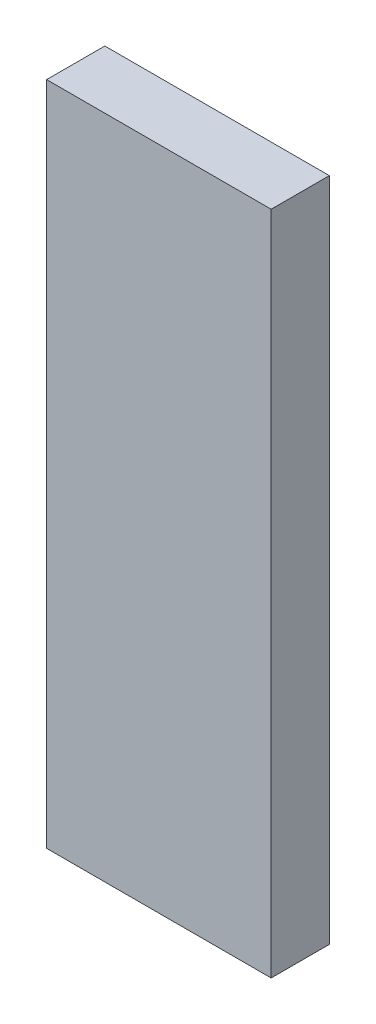
ISO-10303-21;
HEADER;
FILE_DESCRIPTION(('STEP AP214'),'2;1');
FILE_NAME('part.step','',(''),(''),'','','');
FILE_SCHEMA(('AUTOMOTIVE_DESIGN { 1 0 10303 214 1 1 1 1 }'));
ENDSEC;
DATA;
#1=APPLICATION_CONTEXT('core data for automotive mechanical design processes');
#2=APPLICATION_PROTOCOL_DEFINITION('international standard','automotive_design',2000,#1);
#3=PRODUCT_CONTEXT('',#1,'mechanical');
#4=PRODUCT('Part','Part','',(#3));
#5=PRODUCT_RELATED_PRODUCT_CATEGORY('part','',(#4));
#6=PRODUCT_DEFINITION_FORMATION('','',#4);
#7=PRODUCT_DEFINITION_CONTEXT('part definition',#1,'design');
#8=PRODUCT_DEFINITION('design','',#6,#7);
#9=PRODUCT_DEFINITION_SHAPE('','',#8);
#10=(LENGTH_UNIT() NAMED_UNIT(*) SI_UNIT(.MILLI.,.METRE.));
#11=(NAMED_UNIT(*) PLANE_ANGLE_UNIT() SI_UNIT($,.RADIAN.));
#12=(NAMED_UNIT(*) SI_UNIT($,.STERADIAN.) SOLID_ANGLE_UNIT());
#13=UNCERTAINTY_MEASURE_WITH_UNIT(LENGTH_MEASURE(1.E-05),#10,'distance_accuracy_value','');
#14=(GEOMETRIC_REPRESENTATION_CONTEXT(3) GLOBAL_UNCERTAINTY_ASSIGNED_CONTEXT((#13)) GLOBAL_UNIT_ASSIGNED_CONTEXT((#10,
#11,#12)) REPRESENTATION_CONTEXT('',''));
#15=CARTESIAN_POINT('',(0.,0.,0.));
#16=DIRECTION('',(0.,0.,1.));
#17=DIRECTION('',(1.,0.,0.));
#18=AXIS2_PLACEMENT_3D('',#15,#16,#17);
#19=CARTESIAN_POINT('',(-24.5,145.3,-6.35));
#20=DIRECTION('',(1.,0.,0.));
#21=DIRECTION('',(0.,0.,-1.));
#22=AXIS2_PLACEMENT_3D('',#19,#20,#21);
#23=PLANE('',#22);
#24=DIRECTION('',(0.,0.,1.));
#25=VECTOR('',#24,1.);
#26=CARTESIAN_POINT('',(-24.5,0.,-6.35));
#27=LINE('',#26,#25);
#28=CARTESIAN_POINT('',(-24.5,0.,-6.35));
#29=VERTEX_POINT('',#28);
#30=CARTESIAN_POINT('',(-24.5,0.,6.35));
#31=VERTEX_POINT('',#30);
#32=EDGE_CURVE('E97',#29,#31,#27,.T.);
#33=ORIENTED_EDGE('',*,*,#32,.T.);
#34=DIRECTION('',(0.,-1.,0.));
#35=VECTOR('',#34,1.);
#36=CARTESIAN_POINT('',(-24.5,145.3,6.35));
#37=LINE('',#36,#35);
#38=CARTESIAN_POINT('',(-24.5,145.3,6.35));
#39=VERTEX_POINT('',#38);
#40=EDGE_CURVE('E11',#39,#31,#37,.T.);
#41=ORIENTED_EDGE('',*,*,#40,.F.);
#42=DIRECTION('',(0.,0.,1.));
#43=VECTOR('',#42,1.);
#44=CARTESIAN_POINT('',(-24.5,145.3,-6.35));
#45=LINE('',#44,#43);
#46=CARTESIAN_POINT('',(-24.5,145.3,-6.35));
#47=VERTEX_POINT('',#46);
#48=EDGE_CURVE('E85',#47,#39,#45,.T.);
#49=ORIENTED_EDGE('',*,*,#48,.F.);
#50=DIRECTION('',(0.,-1.,0.));
#51=VECTOR('',#50,1.);
#52=CARTESIAN_POINT('',(-24.5,145.3,-6.35));
#53=LINE('',#52,#51);
#54=EDGE_CURVE('E93',#47,#29,#53,.T.);
#55=ORIENTED_EDGE('',*,*,#54,.T.);
#56=EDGE_LOOP('',(#33,#41,#49,#55));
#57=FACE_BOUND('',#56,.T.);
#58=ADVANCED_FACE('F34',(#57),#23,.F.);
#59=CARTESIAN_POINT('',(24.5,145.3,6.35));
#60=DIRECTION('',(0.,0.,-1.));
#61=DIRECTION('',(-1.,0.,0.));
#62=AXIS2_PLACEMENT_3D('',#59,#60,#61);
#63=PLANE('',#62);
#64=DIRECTION('',(1.,0.,0.));
#65=VECTOR('',#64,1.);
#66=CARTESIAN_POINT('',(24.5,0.,6.35));
#67=LINE('',#66,#65);
#68=CARTESIAN_POINT('',(24.5,0.,6.35));
#69=VERTEX_POINT('',#68);
#70=EDGE_CURVE('E89',#31,#69,#67,.T.);
#71=ORIENTED_EDGE('',*,*,#70,.T.);
#72=DIRECTION('',(0.,-1.,0.));
#73=VECTOR('',#72,1.);
#74=CARTESIAN_POINT('',(24.5,145.3,6.35));
#75=LINE('',#74,#73);
#76=CARTESIAN_POINT('',(24.5,145.3,6.35));
#77=VERTEX_POINT('',#76);
#78=EDGE_CURVE('E42',#77,#69,#75,.T.);
#79=ORIENTED_EDGE('',*,*,#78,.F.);
#80=DIRECTION('',(1.,0.,0.));
#81=VECTOR('',#80,1.);
#82=CARTESIAN_POINT('',(24.5,145.3,6.35));
#83=LINE('',#82,#81);
#84=EDGE_CURVE('E80',#39,#77,#83,.T.);
#85=ORIENTED_EDGE('',*,*,#84,.F.);
#86=ORIENTED_EDGE('',*,*,#40,.T.);
#87=EDGE_LOOP('',(#71,#79,#85,#86));
#88=FACE_BOUND('',#87,.T.);
#89=ADVANCED_FACE('F88',(#88),#63,.F.);
#90=CARTESIAN_POINT('',(24.5,145.3,-6.35));
#91=DIRECTION('',(-1.,0.,0.));
#92=DIRECTION('',(0.,0.,1.));
#93=AXIS2_PLACEMENT_3D('',#90,#91,#92);
#94=PLANE('',#93);
#95=DIRECTION('',(0.,0.,-1.));
#96=VECTOR('',#95,1.);
#97=CARTESIAN_POINT('',(24.5,0.,-6.35));
#98=LINE('',#97,#96);
#99=CARTESIAN_POINT('',(24.5,0.,-6.35));
#100=VERTEX_POINT('',#99);
#101=EDGE_CURVE('E67',#69,#100,#98,.T.);
#102=ORIENTED_EDGE('',*,*,#101,.T.);
#103=DIRECTION('',(0.,-1.,0.));
#104=VECTOR('',#103,1.);
#105=CARTESIAN_POINT('',(24.5,145.3,-6.35));
#106=LINE('',#105,#104);
#107=CARTESIAN_POINT('',(24.5,145.3,-6.35));
#108=VERTEX_POINT('',#107);
#109=EDGE_CURVE('E90',#108,#100,#106,.T.);
#110=ORIENTED_EDGE('',*,*,#109,.F.);
#111=DIRECTION('',(0.,0.,-1.));
#112=VECTOR('',#111,1.);
#113=CARTESIAN_POINT('',(24.5,145.3,-6.35));
#114=LINE('',#113,#112);
#115=EDGE_CURVE('E83',#77,#108,#114,.T.);
#116=ORIENTED_EDGE('',*,*,#115,.F.);
#117=ORIENTED_EDGE('',*,*,#78,.T.);
#118=EDGE_LOOP('',(#102,#110,#116,#117));
#119=FACE_BOUND('',#118,.T.);
#120=ADVANCED_FACE('F91',(#119),#94,.F.);
#121=CARTESIAN_POINT('',(24.5,145.3,-6.35));
#122=DIRECTION('',(0.,0.,1.));
#123=DIRECTION('',(1.,0.,0.));
#124=AXIS2_PLACEMENT_3D('',#121,#122,#123);
#125=PLANE('',#124);
#126=DIRECTION('',(-1.,0.,0.));
#127=VECTOR('',#126,1.);
#128=CARTESIAN_POINT('',(24.5,0.,-6.35));
#129=LINE('',#128,#127);
#130=EDGE_CURVE('E73',#100,#29,#129,.T.);
#131=ORIENTED_EDGE('',*,*,#130,.T.);
#132=ORIENTED_EDGE('',*,*,#54,.F.);
#133=DIRECTION('',(-1.,0.,0.));
#134=VECTOR('',#133,1.);
#135=CARTESIAN_POINT('',(24.5,145.3,-6.35));
#136=LINE('',#135,#134);
#137=EDGE_CURVE('E50',#108,#47,#136,.T.);
#138=ORIENTED_EDGE('',*,*,#137,.F.);
#139=ORIENTED_EDGE('',*,*,#109,.T.);
#140=EDGE_LOOP('',(#131,#132,#138,#139));
#141=FACE_BOUND('',#140,.T.);
#142=ADVANCED_FACE('F104',(#141),#125,.F.);
#143=CARTESIAN_POINT('',(0.,145.3,0.));
#144=DIRECTION('',(0.,-1.,0.));
#145=DIRECTION('',(0.,0.,-1.));
#146=AXIS2_PLACEMENT_3D('',#143,#144,#145);
#147=PLANE('',#146);
#148=ORIENTED_EDGE('',*,*,#48,.T.);
#149=ORIENTED_EDGE('',*,*,#84,.T.);
#150=ORIENTED_EDGE('',*,*,#115,.T.);
#151=ORIENTED_EDGE('',*,*,#137,.T.);
#152=EDGE_LOOP('',(#148,#149,#150,#151));
#153=FACE_BOUND('',#152,.T.);
#154=ADVANCED_FACE('F81',(#153),#147,.F.);
#155=CARTESIAN_POINT('',(0.,0.,0.));
#156=DIRECTION('',(0.,-1.,0.));
#157=DIRECTION('',(0.,0.,-1.));
#158=AXIS2_PLACEMENT_3D('',#155,#156,#157);
#159=PLANE('',#158);
#160=ORIENTED_EDGE('',*,*,#32,.F.);
#161=ORIENTED_EDGE('',*,*,#130,.F.);
#162=ORIENTED_EDGE('',*,*,#101,.F.);
#163=ORIENTED_EDGE('',*,*,#70,.F.);
#164=EDGE_LOOP('',(#160,#161,#162,#163));
#165=FACE_BOUND('',#164,.T.);
#166=ADVANCED_FACE('F107',(#165),#159,.T.);
#167=CLOSED_SHELL('',(#58,#89,#120,#142,#154,#166));
#168=MANIFOLD_SOLID_BREP('B2',#167);
#169=ADVANCED_BREP_SHAPE_REPRESENTATION('',(#18,#168),#14);
#170=SHAPE_DEFINITION_REPRESENTATION(#9,#169);
ENDSEC;
END-ISO-10303-21;
